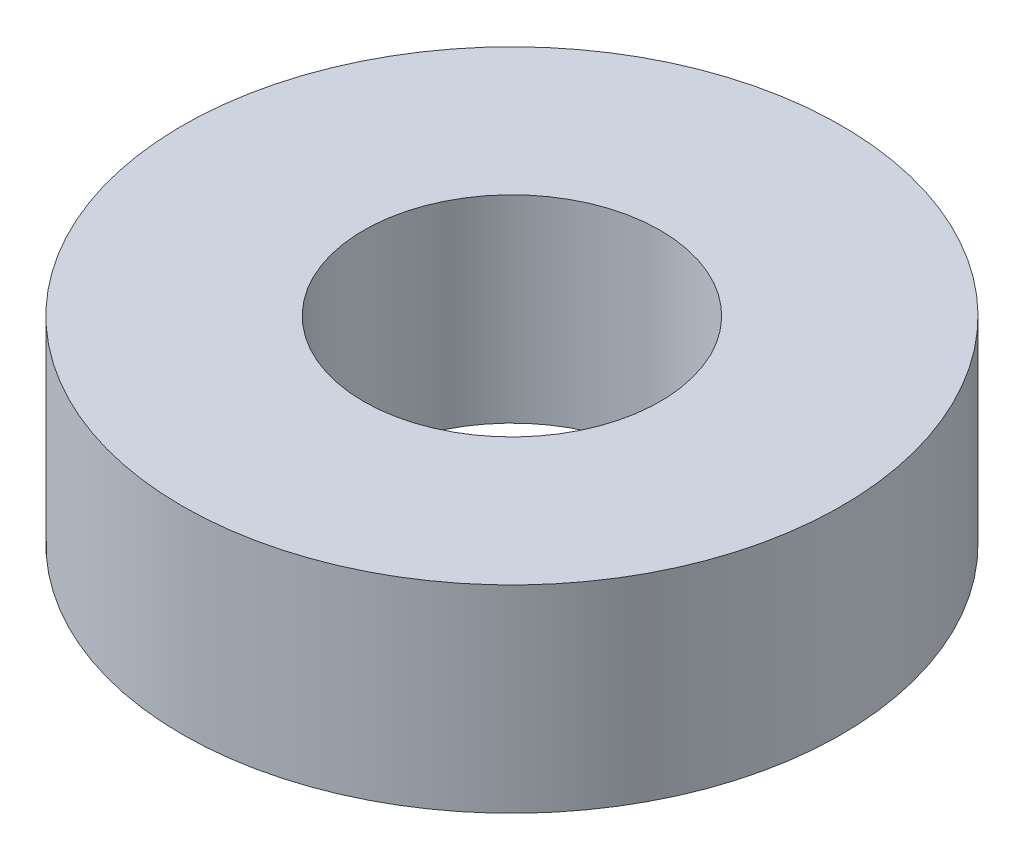
ISO-10303-21;
HEADER;
FILE_DESCRIPTION(('STEP AP214'),'2;1');
FILE_NAME('part.step','',(''),(''),'','','');
FILE_SCHEMA(('AUTOMOTIVE_DESIGN { 1 0 10303 214 1 1 1 1 }'));
ENDSEC;
DATA;
#1=APPLICATION_CONTEXT('core data for automotive mechanical design processes');
#2=APPLICATION_PROTOCOL_DEFINITION('international standard','automotive_design',2000,#1);
#3=PRODUCT_CONTEXT('',#1,'mechanical');
#4=PRODUCT('Part','Part','',(#3));
#5=PRODUCT_RELATED_PRODUCT_CATEGORY('part','',(#4));
#6=PRODUCT_DEFINITION_FORMATION('','',#4);
#7=PRODUCT_DEFINITION_CONTEXT('part definition',#1,'design');
#8=PRODUCT_DEFINITION('design','',#6,#7);
#9=PRODUCT_DEFINITION_SHAPE('','',#8);
#10=(LENGTH_UNIT() NAMED_UNIT(*) SI_UNIT(.MILLI.,.METRE.));
#11=(NAMED_UNIT(*) PLANE_ANGLE_UNIT() SI_UNIT($,.RADIAN.));
#12=(NAMED_UNIT(*) SI_UNIT($,.STERADIAN.) SOLID_ANGLE_UNIT());
#13=UNCERTAINTY_MEASURE_WITH_UNIT(LENGTH_MEASURE(1.E-05),#10,'distance_accuracy_value','');
#14=(GEOMETRIC_REPRESENTATION_CONTEXT(3) GLOBAL_UNCERTAINTY_ASSIGNED_CONTEXT((#13)) GLOBAL_UNIT_ASSIGNED_CONTEXT((#10,
#11,#12)) REPRESENTATION_CONTEXT('',''));
#15=CARTESIAN_POINT('',(0.,0.,0.));
#16=DIRECTION('',(0.,0.,1.));
#17=DIRECTION('',(1.,0.,0.));
#18=AXIS2_PLACEMENT_3D('',#15,#16,#17);
#19=CARTESIAN_POINT('',(0.,6.,0.));
#20=DIRECTION('',(0.,1.,0.));
#21=DIRECTION('',(0.,0.,1.));
#22=AXIS2_PLACEMENT_3D('',#19,#20,#21);
#23=PLANE('',#22);
#24=CARTESIAN_POINT('',(0.,6.,0.));
#25=DIRECTION('',(0.,1.,0.));
#26=DIRECTION('',(0.,0.,1.));
#27=AXIS2_PLACEMENT_3D('',#24,#25,#26);
#28=CIRCLE('',#27,10.);
#29=CARTESIAN_POINT('',(0.,6.,10.));
#30=VERTEX_POINT('',#29);
#31=EDGE_CURVE('E10',#30,#30,#28,.T.);
#32=ORIENTED_EDGE('',*,*,#31,.T.);
#33=EDGE_LOOP('',(#32));
#34=FACE_BOUND('',#33,.T.);
#35=CARTESIAN_POINT('',(0.,6.,0.));
#36=DIRECTION('',(0.,1.,0.));
#37=DIRECTION('',(0.,0.,1.));
#38=AXIS2_PLACEMENT_3D('',#35,#36,#37);
#39=CIRCLE('',#38,4.5);
#40=CARTESIAN_POINT('',(0.,6.,4.5));
#41=VERTEX_POINT('',#40);
#42=EDGE_CURVE('E42',#41,#41,#39,.T.);
#43=ORIENTED_EDGE('',*,*,#42,.F.);
#44=EDGE_LOOP('',(#43));
#45=FACE_BOUND('',#44,.T.);
#46=ADVANCED_FACE('F31',(#34,#45),#23,.T.);
#47=CARTESIAN_POINT('',(0.,0.,0.));
#48=DIRECTION('',(0.,1.,0.));
#49=DIRECTION('',(0.,0.,1.));
#50=AXIS2_PLACEMENT_3D('',#47,#48,#49);
#51=PLANE('',#50);
#52=CARTESIAN_POINT('',(0.,0.,0.));
#53=DIRECTION('',(0.,1.,0.));
#54=DIRECTION('',(0.,0.,1.));
#55=AXIS2_PLACEMENT_3D('',#52,#53,#54);
#56=CIRCLE('',#55,10.);
#57=CARTESIAN_POINT('',(0.,0.,10.));
#58=VERTEX_POINT('',#57);
#59=EDGE_CURVE('E35',#58,#58,#56,.T.);
#60=ORIENTED_EDGE('',*,*,#59,.F.);
#61=EDGE_LOOP('',(#60));
#62=FACE_BOUND('',#61,.T.);
#63=CARTESIAN_POINT('',(0.,0.,0.));
#64=DIRECTION('',(0.,1.,0.));
#65=DIRECTION('',(0.,0.,1.));
#66=AXIS2_PLACEMENT_3D('',#63,#64,#65);
#67=CIRCLE('',#66,4.5);
#68=CARTESIAN_POINT('',(0.,0.,4.5));
#69=VERTEX_POINT('',#68);
#70=EDGE_CURVE('E44',#69,#69,#67,.T.);
#71=ORIENTED_EDGE('',*,*,#70,.T.);
#72=EDGE_LOOP('',(#71));
#73=FACE_BOUND('',#72,.T.);
#74=ADVANCED_FACE('F54',(#62,#73),#51,.F.);
#75=CARTESIAN_POINT('',(0.,6.,0.));
#76=DIRECTION('',(0.,-1.,0.));
#77=DIRECTION('',(0.,0.,-1.));
#78=AXIS2_PLACEMENT_3D('',#75,#76,#77);
#79=CYLINDRICAL_SURFACE('',#78,10.);
#80=ORIENTED_EDGE('',*,*,#31,.F.);
#81=EDGE_LOOP('',(#80));
#82=FACE_BOUND('',#81,.T.);
#83=ORIENTED_EDGE('',*,*,#59,.T.);
#84=EDGE_LOOP('',(#83));
#85=FACE_BOUND('',#84,.T.);
#86=ADVANCED_FACE('F33',(#82,#85),#79,.T.);
#87=CARTESIAN_POINT('',(0.,6.,0.));
#88=DIRECTION('',(0.,-1.,0.));
#89=DIRECTION('',(0.,0.,-1.));
#90=AXIS2_PLACEMENT_3D('',#87,#88,#89);
#91=CYLINDRICAL_SURFACE('',#90,4.5);
#92=ORIENTED_EDGE('',*,*,#42,.T.);
#93=EDGE_LOOP('',(#92));
#94=FACE_BOUND('',#93,.T.);
#95=ORIENTED_EDGE('',*,*,#70,.F.);
#96=EDGE_LOOP('',(#95));
#97=FACE_BOUND('',#96,.T.);
#98=ADVANCED_FACE('F50',(#94,#97),#91,.F.);
#99=CLOSED_SHELL('',(#46,#74,#86,#98));
#100=MANIFOLD_SOLID_BREP('B2',#99);
#101=ADVANCED_BREP_SHAPE_REPRESENTATION('',(#18,#100),#14);
#102=SHAPE_DEFINITION_REPRESENTATION(#9,#101);
ENDSEC;
END-ISO-10303-21;
